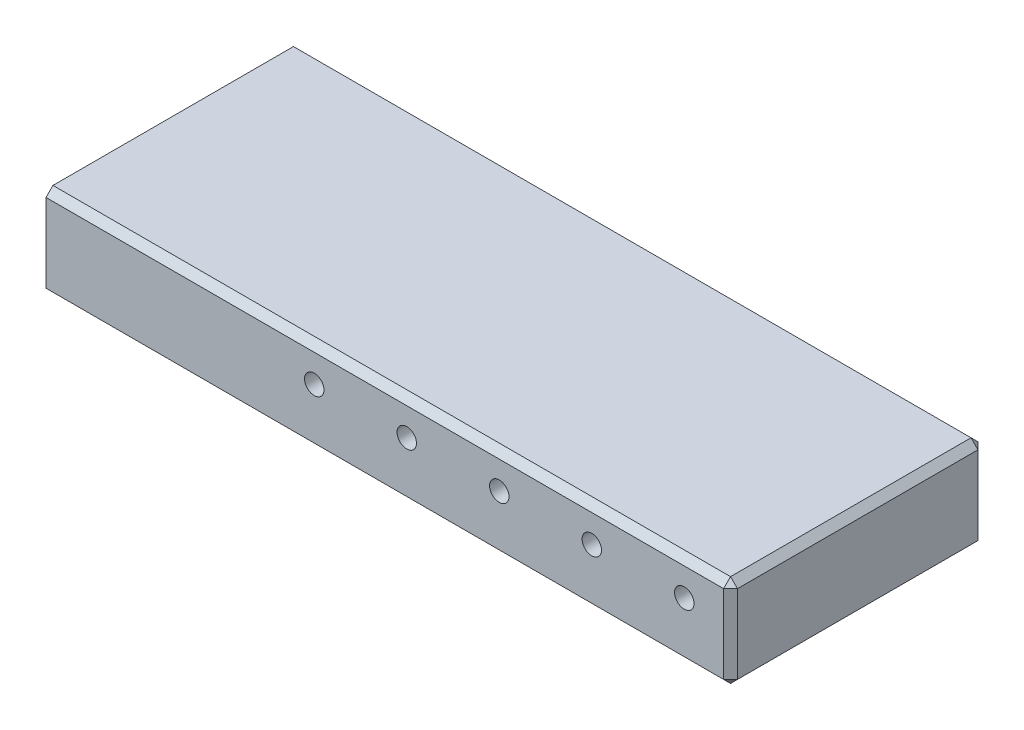
ISO-10303-21;
HEADER;
FILE_DESCRIPTION(('STEP AP214'),'2;1');
FILE_NAME('part.step','',(''),(''),'','','');
FILE_SCHEMA(('AUTOMOTIVE_DESIGN { 1 0 10303 214 1 1 1 1 }'));
ENDSEC;
DATA;
#1=APPLICATION_CONTEXT('core data for automotive mechanical design processes');
#2=APPLICATION_PROTOCOL_DEFINITION('international standard','automotive_design',2000,#1);
#3=PRODUCT_CONTEXT('',#1,'mechanical');
#4=PRODUCT('Part','Part','',(#3));
#5=PRODUCT_RELATED_PRODUCT_CATEGORY('part','',(#4));
#6=PRODUCT_DEFINITION_FORMATION('','',#4);
#7=PRODUCT_DEFINITION_CONTEXT('part definition',#1,'design');
#8=PRODUCT_DEFINITION('design','',#6,#7);
#9=PRODUCT_DEFINITION_SHAPE('','',#8);
#10=(LENGTH_UNIT() NAMED_UNIT(*) SI_UNIT(.MILLI.,.METRE.));
#11=(NAMED_UNIT(*) PLANE_ANGLE_UNIT() SI_UNIT($,.RADIAN.));
#12=(NAMED_UNIT(*) SI_UNIT($,.STERADIAN.) SOLID_ANGLE_UNIT());
#13=UNCERTAINTY_MEASURE_WITH_UNIT(LENGTH_MEASURE(1.E-05),#10,'distance_accuracy_value','');
#14=(GEOMETRIC_REPRESENTATION_CONTEXT(3) GLOBAL_UNCERTAINTY_ASSIGNED_CONTEXT((#13)) GLOBAL_UNIT_ASSIGNED_CONTEXT((#10,
#11,#12)) REPRESENTATION_CONTEXT('',''));
#15=CARTESIAN_POINT('',(0.,0.,0.));
#16=DIRECTION('',(0.,0.,1.));
#17=DIRECTION('',(1.,0.,0.));
#18=AXIS2_PLACEMENT_3D('',#15,#16,#17);
#19=CARTESIAN_POINT('',(0.,0.,55.));
#20=DIRECTION('',(0.,1.,0.));
#21=DIRECTION('',(0.,0.,1.));
#22=AXIS2_PLACEMENT_3D('',#19,#20,#21);
#23=PLANE('',#22);
#24=DIRECTION('',(-1.,0.,0.));
#25=VECTOR('',#24,1.);
#26=CARTESIAN_POINT('',(0.,0.,53.5));
#27=LINE('',#26,#25);
#28=CARTESIAN_POINT('',(108.5,0.,53.5));
#29=VERTEX_POINT('',#28);
#30=CARTESIAN_POINT('',(-38.,0.,53.5));
#31=VERTEX_POINT('',#30);
#32=EDGE_CURVE('E262',#29,#31,#27,.T.);
#33=ORIENTED_EDGE('',*,*,#32,.T.);
#34=DIRECTION('',(0.,0.,1.));
#35=VECTOR('',#34,1.);
#36=CARTESIAN_POINT('',(-38.,0.,53.5));
#37=LINE('',#36,#35);
#38=CARTESIAN_POINT('',(-38.,0.,1.50000000000002));
#39=VERTEX_POINT('',#38);
#40=EDGE_CURVE('E181',#39,#31,#37,.T.);
#41=ORIENTED_EDGE('',*,*,#40,.F.);
#42=DIRECTION('',(1.,0.,0.));
#43=VECTOR('',#42,1.);
#44=CARTESIAN_POINT('',(110.,0.,1.50000000000002));
#45=LINE('',#44,#43);
#46=CARTESIAN_POINT('',(108.5,0.,1.50000000000002));
#47=VERTEX_POINT('',#46);
#48=EDGE_CURVE('E264',#39,#47,#45,.T.);
#49=ORIENTED_EDGE('',*,*,#48,.T.);
#50=DIRECTION('',(0.,0.,1.));
#51=VECTOR('',#50,1.);
#52=CARTESIAN_POINT('',(108.5,0.,55.));
#53=LINE('',#52,#51);
#54=EDGE_CURVE('E260',#47,#29,#53,.T.);
#55=ORIENTED_EDGE('',*,*,#54,.T.);
#56=EDGE_LOOP('',(#33,#41,#49,#55));
#57=FACE_BOUND('',#56,.T.);
#58=ADVANCED_FACE('F39',(#57),#23,.F.);
#59=CARTESIAN_POINT('',(110.,0.,55.));
#60=DIRECTION('',(-1.,0.,0.));
#61=DIRECTION('',(0.,0.,1.));
#62=AXIS2_PLACEMENT_3D('',#59,#60,#61);
#63=PLANE('',#62);
#64=DIRECTION('',(0.,-1.,0.));
#65=VECTOR('',#64,1.);
#66=CARTESIAN_POINT('',(110.,0.,53.5));
#67=LINE('',#66,#65);
#68=CARTESIAN_POINT('',(110.,18.5,53.5));
#69=VERTEX_POINT('',#68);
#70=CARTESIAN_POINT('',(110.,1.50000000000002,53.5));
#71=VERTEX_POINT('',#70);
#72=EDGE_CURVE('E285',#69,#71,#67,.T.);
#73=ORIENTED_EDGE('',*,*,#72,.T.);
#74=DIRECTION('',(0.,0.,-1.));
#75=VECTOR('',#74,1.);
#76=CARTESIAN_POINT('',(110.,1.50000000000002,55.));
#77=LINE('',#76,#75);
#78=CARTESIAN_POINT('',(110.,1.50000000000002,1.50000000000002));
#79=VERTEX_POINT('',#78);
#80=EDGE_CURVE('E11',#71,#79,#77,.T.);
#81=ORIENTED_EDGE('',*,*,#80,.T.);
#82=DIRECTION('',(0.,1.,0.));
#83=VECTOR('',#82,1.);
#84=CARTESIAN_POINT('',(110.,20.,1.50000000000002));
#85=LINE('',#84,#83);
#86=CARTESIAN_POINT('',(110.,18.5,1.50000000000002));
#87=VERTEX_POINT('',#86);
#88=EDGE_CURVE('E49',#79,#87,#85,.T.);
#89=ORIENTED_EDGE('',*,*,#88,.T.);
#90=DIRECTION('',(0.,0.,1.));
#91=VECTOR('',#90,1.);
#92=CARTESIAN_POINT('',(110.,18.5,55.));
#93=LINE('',#92,#91);
#94=EDGE_CURVE('E287',#87,#69,#93,.T.);
#95=ORIENTED_EDGE('',*,*,#94,.T.);
#96=EDGE_LOOP('',(#73,#81,#89,#95));
#97=FACE_BOUND('',#96,.T.);
#98=ADVANCED_FACE('F350',(#97),#63,.F.);
#99=CARTESIAN_POINT('',(20.,20.,55.));
#100=DIRECTION('',(0.,-1.,0.));
#101=DIRECTION('',(0.,0.,-1.));
#102=AXIS2_PLACEMENT_3D('',#99,#100,#101);
#103=PLANE('',#102);
#104=DIRECTION('',(0.,0.,-1.));
#105=VECTOR('',#104,1.);
#106=CARTESIAN_POINT('',(108.5,20.,55.));
#107=LINE('',#106,#105);
#108=CARTESIAN_POINT('',(108.5,20.,53.5));
#109=VERTEX_POINT('',#108);
#110=CARTESIAN_POINT('',(108.5,20.,1.50000000000002));
#111=VERTEX_POINT('',#110);
#112=EDGE_CURVE('E281',#109,#111,#107,.T.);
#113=ORIENTED_EDGE('',*,*,#112,.T.);
#114=DIRECTION('',(-1.,0.,0.));
#115=VECTOR('',#114,1.);
#116=CARTESIAN_POINT('',(12.,20.,1.50000000000002));
#117=LINE('',#116,#115);
#118=CARTESIAN_POINT('',(-38.,20.,1.50000000000002));
#119=VERTEX_POINT('',#118);
#120=EDGE_CURVE('E283',#111,#119,#117,.T.);
#121=ORIENTED_EDGE('',*,*,#120,.T.);
#122=DIRECTION('',(0.,0.,-1.));
#123=VECTOR('',#122,1.);
#124=CARTESIAN_POINT('',(-38.,20.,1.50000000000002));
#125=LINE('',#124,#123);
#126=CARTESIAN_POINT('',(-38.,20.,53.5));
#127=VERTEX_POINT('',#126);
#128=EDGE_CURVE('E193',#127,#119,#125,.T.);
#129=ORIENTED_EDGE('',*,*,#128,.F.);
#130=DIRECTION('',(1.,0.,0.));
#131=VECTOR('',#130,1.);
#132=CARTESIAN_POINT('',(20.,20.,53.5));
#133=LINE('',#132,#131);
#134=EDGE_CURVE('E279',#127,#109,#133,.T.);
#135=ORIENTED_EDGE('',*,*,#134,.T.);
#136=EDGE_LOOP('',(#113,#121,#129,#135));
#137=FACE_BOUND('',#136,.T.);
#138=ADVANCED_FACE('F356',(#137),#103,.F.);
#139=CARTESIAN_POINT('',(0.,0.,55.));
#140=DIRECTION('',(0.,0.,-1.));
#141=DIRECTION('',(-1.,0.,0.));
#142=AXIS2_PLACEMENT_3D('',#139,#140,#141);
#143=PLANE('',#142);
#144=CARTESIAN_POINT('',(100.,12.5,55.));
#145=DIRECTION('',(0.,0.,1.));
#146=DIRECTION('',(1.,0.,0.));
#147=AXIS2_PLACEMENT_3D('',#144,#145,#146);
#148=CIRCLE('',#147,2.09999999999999);
#149=CARTESIAN_POINT('',(102.1,12.5,55.));
#150=VERTEX_POINT('',#149);
#151=EDGE_CURVE('E230',#150,#150,#148,.T.);
#152=ORIENTED_EDGE('',*,*,#151,.F.);
#153=EDGE_LOOP('',(#152));
#154=FACE_BOUND('',#153,.T.);
#155=CARTESIAN_POINT('',(80.,12.5,55.));
#156=DIRECTION('',(0.,0.,1.));
#157=DIRECTION('',(1.,0.,0.));
#158=AXIS2_PLACEMENT_3D('',#155,#156,#157);
#159=CIRCLE('',#158,2.09999999999999);
#160=CARTESIAN_POINT('',(82.1,12.5,55.));
#161=VERTEX_POINT('',#160);
#162=EDGE_CURVE('E236',#161,#161,#159,.T.);
#163=ORIENTED_EDGE('',*,*,#162,.F.);
#164=EDGE_LOOP('',(#163));
#165=FACE_BOUND('',#164,.T.);
#166=CARTESIAN_POINT('',(60.,12.5,55.));
#167=DIRECTION('',(0.,0.,1.));
#168=DIRECTION('',(1.,0.,0.));
#169=AXIS2_PLACEMENT_3D('',#166,#167,#168);
#170=CIRCLE('',#169,2.09999999999999);
#171=CARTESIAN_POINT('',(62.1,12.5,55.));
#172=VERTEX_POINT('',#171);
#173=EDGE_CURVE('E242',#172,#172,#170,.T.);
#174=ORIENTED_EDGE('',*,*,#173,.F.);
#175=EDGE_LOOP('',(#174));
#176=FACE_BOUND('',#175,.T.);
#177=CARTESIAN_POINT('',(40.,12.5,55.));
#178=DIRECTION('',(0.,0.,1.));
#179=DIRECTION('',(1.,0.,0.));
#180=AXIS2_PLACEMENT_3D('',#177,#178,#179);
#181=CIRCLE('',#180,2.09999999999999);
#182=CARTESIAN_POINT('',(42.1,12.5,55.));
#183=VERTEX_POINT('',#182);
#184=EDGE_CURVE('E248',#183,#183,#181,.T.);
#185=ORIENTED_EDGE('',*,*,#184,.F.);
#186=EDGE_LOOP('',(#185));
#187=FACE_BOUND('',#186,.T.);
#188=CARTESIAN_POINT('',(20.,12.5,55.));
#189=DIRECTION('',(0.,0.,1.));
#190=DIRECTION('',(1.,0.,0.));
#191=AXIS2_PLACEMENT_3D('',#188,#189,#190);
#192=CIRCLE('',#191,2.09999999999999);
#193=CARTESIAN_POINT('',(22.1,12.5,55.));
#194=VERTEX_POINT('',#193);
#195=EDGE_CURVE('E254',#194,#194,#192,.T.);
#196=ORIENTED_EDGE('',*,*,#195,.F.);
#197=EDGE_LOOP('',(#196));
#198=FACE_BOUND('',#197,.T.);
#199=DIRECTION('',(-1.,0.,0.));
#200=VECTOR('',#199,1.);
#201=CARTESIAN_POINT('',(0.,18.5,55.));
#202=LINE('',#201,#200);
#203=CARTESIAN_POINT('',(108.5,18.5,55.));
#204=VERTEX_POINT('',#203);
#205=CARTESIAN_POINT('',(-38.,18.5,55.));
#206=VERTEX_POINT('',#205);
#207=EDGE_CURVE('E273',#204,#206,#202,.T.);
#208=ORIENTED_EDGE('',*,*,#207,.T.);
#209=DIRECTION('',(0.,1.,0.));
#210=VECTOR('',#209,1.);
#211=CARTESIAN_POINT('',(-38.,18.5,55.));
#212=LINE('',#211,#210);
#213=CARTESIAN_POINT('',(-38.,1.50000000000002,55.));
#214=VERTEX_POINT('',#213);
#215=EDGE_CURVE('E187',#214,#206,#212,.T.);
#216=ORIENTED_EDGE('',*,*,#215,.F.);
#217=DIRECTION('',(1.,0.,0.));
#218=VECTOR('',#217,1.);
#219=CARTESIAN_POINT('',(0.,1.50000000000002,55.));
#220=LINE('',#219,#218);
#221=CARTESIAN_POINT('',(108.5,1.50000000000002,55.));
#222=VERTEX_POINT('',#221);
#223=EDGE_CURVE('E277',#214,#222,#220,.T.);
#224=ORIENTED_EDGE('',*,*,#223,.T.);
#225=DIRECTION('',(0.,1.,0.));
#226=VECTOR('',#225,1.);
#227=CARTESIAN_POINT('',(108.5,0.,55.));
#228=LINE('',#227,#226);
#229=EDGE_CURVE('E275',#222,#204,#228,.T.);
#230=ORIENTED_EDGE('',*,*,#229,.T.);
#231=EDGE_LOOP('',(#208,#216,#224,#230));
#232=FACE_BOUND('',#231,.T.);
#233=ADVANCED_FACE('F331',(#154,#165,#176,#187,#198,#232),#143,.F.);
#234=CARTESIAN_POINT('',(0.,0.,0.));
#235=DIRECTION('',(0.,0.,-1.));
#236=DIRECTION('',(-1.,0.,0.));
#237=AXIS2_PLACEMENT_3D('',#234,#235,#236);
#238=PLANE('',#237);
#239=DIRECTION('',(0.,-1.,0.));
#240=VECTOR('',#239,1.);
#241=CARTESIAN_POINT('',(108.5,0.,0.));
#242=LINE('',#241,#240);
#243=CARTESIAN_POINT('',(108.5,18.5,0.));
#244=VERTEX_POINT('',#243);
#245=CARTESIAN_POINT('',(108.5,1.50000000000002,0.));
#246=VERTEX_POINT('',#245);
#247=EDGE_CURVE('E267',#244,#246,#242,.T.);
#248=ORIENTED_EDGE('',*,*,#247,.T.);
#249=DIRECTION('',(-1.,0.,0.));
#250=VECTOR('',#249,1.);
#251=CARTESIAN_POINT('',(12.,1.50000000000002,0.));
#252=LINE('',#251,#250);
#253=CARTESIAN_POINT('',(-38.,1.50000000000002,0.));
#254=VERTEX_POINT('',#253);
#255=EDGE_CURVE('E271',#246,#254,#252,.T.);
#256=ORIENTED_EDGE('',*,*,#255,.T.);
#257=DIRECTION('',(0.,-1.,0.));
#258=VECTOR('',#257,1.);
#259=CARTESIAN_POINT('',(-38.,1.50000000000002,0.));
#260=LINE('',#259,#258);
#261=CARTESIAN_POINT('',(-38.,18.5,0.));
#262=VERTEX_POINT('',#261);
#263=EDGE_CURVE('E175',#262,#254,#260,.T.);
#264=ORIENTED_EDGE('',*,*,#263,.F.);
#265=DIRECTION('',(1.,0.,0.));
#266=VECTOR('',#265,1.);
#267=CARTESIAN_POINT('',(110.,18.5,0.));
#268=LINE('',#267,#266);
#269=EDGE_CURVE('E269',#262,#244,#268,.T.);
#270=ORIENTED_EDGE('',*,*,#269,.T.);
#271=EDGE_LOOP('',(#248,#256,#264,#270));
#272=FACE_BOUND('',#271,.T.);
#273=CARTESIAN_POINT('',(100.,12.5,0.));
#274=DIRECTION('',(0.,0.,-1.));
#275=DIRECTION('',(-1.,0.,0.));
#276=AXIS2_PLACEMENT_3D('',#273,#274,#275);
#277=CIRCLE('',#276,2.09999999999999);
#278=CARTESIAN_POINT('',(97.9,12.5,0.));
#279=VERTEX_POINT('',#278);
#280=EDGE_CURVE('E200',#279,#279,#277,.T.);
#281=ORIENTED_EDGE('',*,*,#280,.F.);
#282=EDGE_LOOP('',(#281));
#283=FACE_BOUND('',#282,.T.);
#284=CARTESIAN_POINT('',(80.,12.5,0.));
#285=DIRECTION('',(0.,0.,-1.));
#286=DIRECTION('',(-1.,0.,0.));
#287=AXIS2_PLACEMENT_3D('',#284,#285,#286);
#288=CIRCLE('',#287,2.09999999999999);
#289=CARTESIAN_POINT('',(77.9,12.5,0.));
#290=VERTEX_POINT('',#289);
#291=EDGE_CURVE('E206',#290,#290,#288,.T.);
#292=ORIENTED_EDGE('',*,*,#291,.F.);
#293=EDGE_LOOP('',(#292));
#294=FACE_BOUND('',#293,.T.);
#295=CARTESIAN_POINT('',(60.,12.5,0.));
#296=DIRECTION('',(0.,0.,-1.));
#297=DIRECTION('',(-1.,0.,0.));
#298=AXIS2_PLACEMENT_3D('',#295,#296,#297);
#299=CIRCLE('',#298,2.09999999999999);
#300=CARTESIAN_POINT('',(57.9,12.5,0.));
#301=VERTEX_POINT('',#300);
#302=EDGE_CURVE('E212',#301,#301,#299,.T.);
#303=ORIENTED_EDGE('',*,*,#302,.F.);
#304=EDGE_LOOP('',(#303));
#305=FACE_BOUND('',#304,.T.);
#306=CARTESIAN_POINT('',(40.,12.5,0.));
#307=DIRECTION('',(0.,0.,-1.));
#308=DIRECTION('',(-1.,0.,0.));
#309=AXIS2_PLACEMENT_3D('',#306,#307,#308);
#310=CIRCLE('',#309,2.09999999999999);
#311=CARTESIAN_POINT('',(37.9,12.5,0.));
#312=VERTEX_POINT('',#311);
#313=EDGE_CURVE('E218',#312,#312,#310,.T.);
#314=ORIENTED_EDGE('',*,*,#313,.F.);
#315=EDGE_LOOP('',(#314));
#316=FACE_BOUND('',#315,.T.);
#317=CARTESIAN_POINT('',(20.,12.5,0.));
#318=DIRECTION('',(0.,0.,-1.));
#319=DIRECTION('',(-1.,0.,0.));
#320=AXIS2_PLACEMENT_3D('',#317,#318,#319);
#321=CIRCLE('',#320,2.09999999999999);
#322=CARTESIAN_POINT('',(17.9,12.5,0.));
#323=VERTEX_POINT('',#322);
#324=EDGE_CURVE('E224',#323,#323,#321,.T.);
#325=ORIENTED_EDGE('',*,*,#324,.F.);
#326=EDGE_LOOP('',(#325));
#327=FACE_BOUND('',#326,.T.);
#328=ADVANCED_FACE('F364',(#272,#283,#294,#305,#316,#327),#238,.T.);
#329=CARTESIAN_POINT('',(20.,12.5,41.));
#330=DIRECTION('',(0.,0.,1.));
#331=DIRECTION('',(1.,0.,0.));
#332=AXIS2_PLACEMENT_3D('',#329,#330,#331);
#333=CONICAL_SURFACE('',#332,2.09999999999999,1.02974425867665);
#334=CARTESIAN_POINT('',(20.,12.5,39.7381927000421));
#335=VERTEX_POINT('',#334);
#336=VERTEX_LOOP('',#335);
#337=FACE_BOUND('',#336,.T.);
#338=CARTESIAN_POINT('',(20.,12.5,41.));
#339=DIRECTION('',(0.,0.,1.));
#340=DIRECTION('',(1.,0.,0.));
#341=AXIS2_PLACEMENT_3D('',#338,#339,#340);
#342=CIRCLE('',#341,2.09999999999999);
#343=CARTESIAN_POINT('',(22.1,12.5,41.));
#344=VERTEX_POINT('',#343);
#345=EDGE_CURVE('E257',#344,#344,#342,.T.);
#346=ORIENTED_EDGE('',*,*,#345,.T.);
#347=EDGE_LOOP('',(#346));
#348=FACE_BOUND('',#347,.T.);
#349=ADVANCED_FACE('F527',(#337,#348),#333,.F.);
#350=CARTESIAN_POINT('',(20.,12.5,55.));
#351=DIRECTION('',(0.,0.,1.));
#352=DIRECTION('',(1.,0.,0.));
#353=AXIS2_PLACEMENT_3D('',#350,#351,#352);
#354=CYLINDRICAL_SURFACE('',#353,2.09999999999999);
#355=ORIENTED_EDGE('',*,*,#345,.F.);
#356=EDGE_LOOP('',(#355));
#357=FACE_BOUND('',#356,.T.);
#358=ORIENTED_EDGE('',*,*,#195,.T.);
#359=EDGE_LOOP('',(#358));
#360=FACE_BOUND('',#359,.T.);
#361=ADVANCED_FACE('F523',(#357,#360),#354,.F.);
#362=CARTESIAN_POINT('',(40.,12.5,41.));
#363=DIRECTION('',(0.,0.,1.));
#364=DIRECTION('',(1.,0.,0.));
#365=AXIS2_PLACEMENT_3D('',#362,#363,#364);
#366=CONICAL_SURFACE('',#365,2.09999999999999,1.02974425867666);
#367=CARTESIAN_POINT('',(40.,12.5,39.7381927000421));
#368=VERTEX_POINT('',#367);
#369=VERTEX_LOOP('',#368);
#370=FACE_BOUND('',#369,.T.);
#371=CARTESIAN_POINT('',(40.,12.5,41.));
#372=DIRECTION('',(0.,0.,1.));
#373=DIRECTION('',(1.,0.,0.));
#374=AXIS2_PLACEMENT_3D('',#371,#372,#373);
#375=CIRCLE('',#374,2.09999999999999);
#376=CARTESIAN_POINT('',(42.1,12.5,41.));
#377=VERTEX_POINT('',#376);
#378=EDGE_CURVE('E251',#377,#377,#375,.T.);
#379=ORIENTED_EDGE('',*,*,#378,.T.);
#380=EDGE_LOOP('',(#379));
#381=FACE_BOUND('',#380,.T.);
#382=ADVANCED_FACE('F519',(#370,#381),#366,.F.);
#383=CARTESIAN_POINT('',(40.,12.5,55.));
#384=DIRECTION('',(0.,0.,1.));
#385=DIRECTION('',(1.,0.,0.));
#386=AXIS2_PLACEMENT_3D('',#383,#384,#385);
#387=CYLINDRICAL_SURFACE('',#386,2.09999999999999);
#388=ORIENTED_EDGE('',*,*,#378,.F.);
#389=EDGE_LOOP('',(#388));
#390=FACE_BOUND('',#389,.T.);
#391=ORIENTED_EDGE('',*,*,#184,.T.);
#392=EDGE_LOOP('',(#391));
#393=FACE_BOUND('',#392,.T.);
#394=ADVANCED_FACE('F515',(#390,#393),#387,.F.);
#395=CARTESIAN_POINT('',(60.,12.5,41.));
#396=DIRECTION('',(0.,0.,1.));
#397=DIRECTION('',(1.,0.,0.));
#398=AXIS2_PLACEMENT_3D('',#395,#396,#397);
#399=CONICAL_SURFACE('',#398,2.09999999999999,1.02974425867666);
#400=CARTESIAN_POINT('',(60.,12.5,39.7381927000421));
#401=VERTEX_POINT('',#400);
#402=VERTEX_LOOP('',#401);
#403=FACE_BOUND('',#402,.T.);
#404=CARTESIAN_POINT('',(60.,12.5,41.));
#405=DIRECTION('',(0.,0.,1.));
#406=DIRECTION('',(1.,0.,0.));
#407=AXIS2_PLACEMENT_3D('',#404,#405,#406);
#408=CIRCLE('',#407,2.09999999999999);
#409=CARTESIAN_POINT('',(62.1,12.5,41.));
#410=VERTEX_POINT('',#409);
#411=EDGE_CURVE('E245',#410,#410,#408,.T.);
#412=ORIENTED_EDGE('',*,*,#411,.T.);
#413=EDGE_LOOP('',(#412));
#414=FACE_BOUND('',#413,.T.);
#415=ADVANCED_FACE('F511',(#403,#414),#399,.F.);
#416=CARTESIAN_POINT('',(60.,12.5,55.));
#417=DIRECTION('',(0.,0.,1.));
#418=DIRECTION('',(1.,0.,0.));
#419=AXIS2_PLACEMENT_3D('',#416,#417,#418);
#420=CYLINDRICAL_SURFACE('',#419,2.09999999999999);
#421=ORIENTED_EDGE('',*,*,#411,.F.);
#422=EDGE_LOOP('',(#421));
#423=FACE_BOUND('',#422,.T.);
#424=ORIENTED_EDGE('',*,*,#173,.T.);
#425=EDGE_LOOP('',(#424));
#426=FACE_BOUND('',#425,.T.);
#427=ADVANCED_FACE('F507',(#423,#426),#420,.F.);
#428=CARTESIAN_POINT('',(80.,12.5,41.));
#429=DIRECTION('',(0.,0.,1.));
#430=DIRECTION('',(1.,0.,0.));
#431=AXIS2_PLACEMENT_3D('',#428,#429,#430);
#432=CONICAL_SURFACE('',#431,2.09999999999999,1.02974425867666);
#433=CARTESIAN_POINT('',(80.,12.5,39.7381927000421));
#434=VERTEX_POINT('',#433);
#435=VERTEX_LOOP('',#434);
#436=FACE_BOUND('',#435,.T.);
#437=CARTESIAN_POINT('',(80.,12.5,41.));
#438=DIRECTION('',(0.,0.,1.));
#439=DIRECTION('',(1.,0.,0.));
#440=AXIS2_PLACEMENT_3D('',#437,#438,#439);
#441=CIRCLE('',#440,2.09999999999999);
#442=CARTESIAN_POINT('',(82.1,12.5,41.));
#443=VERTEX_POINT('',#442);
#444=EDGE_CURVE('E239',#443,#443,#441,.T.);
#445=ORIENTED_EDGE('',*,*,#444,.T.);
#446=EDGE_LOOP('',(#445));
#447=FACE_BOUND('',#446,.T.);
#448=ADVANCED_FACE('F503',(#436,#447),#432,.F.);
#449=CARTESIAN_POINT('',(80.,12.5,55.));
#450=DIRECTION('',(0.,0.,1.));
#451=DIRECTION('',(1.,0.,0.));
#452=AXIS2_PLACEMENT_3D('',#449,#450,#451);
#453=CYLINDRICAL_SURFACE('',#452,2.09999999999999);
#454=ORIENTED_EDGE('',*,*,#444,.F.);
#455=EDGE_LOOP('',(#454));
#456=FACE_BOUND('',#455,.T.);
#457=ORIENTED_EDGE('',*,*,#162,.T.);
#458=EDGE_LOOP('',(#457));
#459=FACE_BOUND('',#458,.T.);
#460=ADVANCED_FACE('F499',(#456,#459),#453,.F.);
#461=CARTESIAN_POINT('',(100.,12.5,41.));
#462=DIRECTION('',(0.,0.,1.));
#463=DIRECTION('',(1.,0.,0.));
#464=AXIS2_PLACEMENT_3D('',#461,#462,#463);
#465=CONICAL_SURFACE('',#464,2.09999999999999,1.02974425867666);
#466=CARTESIAN_POINT('',(100.,12.5,39.7381927000421));
#467=VERTEX_POINT('',#466);
#468=VERTEX_LOOP('',#467);
#469=FACE_BOUND('',#468,.T.);
#470=CARTESIAN_POINT('',(100.,12.5,41.));
#471=DIRECTION('',(0.,0.,1.));
#472=DIRECTION('',(1.,0.,0.));
#473=AXIS2_PLACEMENT_3D('',#470,#471,#472);
#474=CIRCLE('',#473,2.09999999999999);
#475=CARTESIAN_POINT('',(102.1,12.5,41.));
#476=VERTEX_POINT('',#475);
#477=EDGE_CURVE('E233',#476,#476,#474,.T.);
#478=ORIENTED_EDGE('',*,*,#477,.T.);
#479=EDGE_LOOP('',(#478));
#480=FACE_BOUND('',#479,.T.);
#481=ADVANCED_FACE('F495',(#469,#480),#465,.F.);
#482=CARTESIAN_POINT('',(100.,12.5,55.));
#483=DIRECTION('',(0.,0.,1.));
#484=DIRECTION('',(1.,0.,0.));
#485=AXIS2_PLACEMENT_3D('',#482,#483,#484);
#486=CYLINDRICAL_SURFACE('',#485,2.09999999999999);
#487=ORIENTED_EDGE('',*,*,#477,.F.);
#488=EDGE_LOOP('',(#487));
#489=FACE_BOUND('',#488,.T.);
#490=ORIENTED_EDGE('',*,*,#151,.T.);
#491=EDGE_LOOP('',(#490));
#492=FACE_BOUND('',#491,.T.);
#493=ADVANCED_FACE('F491',(#489,#492),#486,.F.);
#494=CARTESIAN_POINT('',(20.,12.5,14.));
#495=DIRECTION('',(0.,0.,-1.));
#496=DIRECTION('',(-1.,0.,0.));
#497=AXIS2_PLACEMENT_3D('',#494,#495,#496);
#498=CONICAL_SURFACE('',#497,2.09999999999999,1.02974425867665);
#499=CARTESIAN_POINT('',(20.,12.5,15.2618072999579));
#500=VERTEX_POINT('',#499);
#501=VERTEX_LOOP('',#500);
#502=FACE_BOUND('',#501,.T.);
#503=CARTESIAN_POINT('',(20.,12.5,14.));
#504=DIRECTION('',(0.,0.,-1.));
#505=DIRECTION('',(-1.,0.,0.));
#506=AXIS2_PLACEMENT_3D('',#503,#504,#505);
#507=CIRCLE('',#506,2.09999999999999);
#508=CARTESIAN_POINT('',(17.9,12.5,14.));
#509=VERTEX_POINT('',#508);
#510=EDGE_CURVE('E227',#509,#509,#507,.T.);
#511=ORIENTED_EDGE('',*,*,#510,.T.);
#512=EDGE_LOOP('',(#511));
#513=FACE_BOUND('',#512,.T.);
#514=ADVANCED_FACE('F487',(#502,#513),#498,.F.);
#515=CARTESIAN_POINT('',(20.,12.5,0.));
#516=DIRECTION('',(0.,0.,-1.));
#517=DIRECTION('',(-1.,0.,0.));
#518=AXIS2_PLACEMENT_3D('',#515,#516,#517);
#519=CYLINDRICAL_SURFACE('',#518,2.09999999999999);
#520=ORIENTED_EDGE('',*,*,#510,.F.);
#521=EDGE_LOOP('',(#520));
#522=FACE_BOUND('',#521,.T.);
#523=ORIENTED_EDGE('',*,*,#324,.T.);
#524=EDGE_LOOP('',(#523));
#525=FACE_BOUND('',#524,.T.);
#526=ADVANCED_FACE('F483',(#522,#525),#519,.F.);
#527=CARTESIAN_POINT('',(40.,12.5,14.));
#528=DIRECTION('',(0.,0.,-1.));
#529=DIRECTION('',(-1.,0.,0.));
#530=AXIS2_PLACEMENT_3D('',#527,#528,#529);
#531=CONICAL_SURFACE('',#530,2.09999999999999,1.02974425867666);
#532=CARTESIAN_POINT('',(40.,12.5,15.2618072999579));
#533=VERTEX_POINT('',#532);
#534=VERTEX_LOOP('',#533);
#535=FACE_BOUND('',#534,.T.);
#536=CARTESIAN_POINT('',(40.,12.5,14.));
#537=DIRECTION('',(0.,0.,-1.));
#538=DIRECTION('',(-1.,0.,0.));
#539=AXIS2_PLACEMENT_3D('',#536,#537,#538);
#540=CIRCLE('',#539,2.09999999999999);
#541=CARTESIAN_POINT('',(37.9,12.5,14.));
#542=VERTEX_POINT('',#541);
#543=EDGE_CURVE('E221',#542,#542,#540,.T.);
#544=ORIENTED_EDGE('',*,*,#543,.T.);
#545=EDGE_LOOP('',(#544));
#546=FACE_BOUND('',#545,.T.);
#547=ADVANCED_FACE('F479',(#535,#546),#531,.F.);
#548=CARTESIAN_POINT('',(40.,12.5,0.));
#549=DIRECTION('',(0.,0.,-1.));
#550=DIRECTION('',(-1.,0.,0.));
#551=AXIS2_PLACEMENT_3D('',#548,#549,#550);
#552=CYLINDRICAL_SURFACE('',#551,2.09999999999999);
#553=ORIENTED_EDGE('',*,*,#543,.F.);
#554=EDGE_LOOP('',(#553));
#555=FACE_BOUND('',#554,.T.);
#556=ORIENTED_EDGE('',*,*,#313,.T.);
#557=EDGE_LOOP('',(#556));
#558=FACE_BOUND('',#557,.T.);
#559=ADVANCED_FACE('F475',(#555,#558),#552,.F.);
#560=CARTESIAN_POINT('',(60.,12.5,14.));
#561=DIRECTION('',(0.,0.,-1.));
#562=DIRECTION('',(-1.,0.,0.));
#563=AXIS2_PLACEMENT_3D('',#560,#561,#562);
#564=CONICAL_SURFACE('',#563,2.09999999999999,1.02974425867666);
#565=CARTESIAN_POINT('',(60.,12.5,15.2618072999579));
#566=VERTEX_POINT('',#565);
#567=VERTEX_LOOP('',#566);
#568=FACE_BOUND('',#567,.T.);
#569=CARTESIAN_POINT('',(60.,12.5,14.));
#570=DIRECTION('',(0.,0.,-1.));
#571=DIRECTION('',(-1.,0.,0.));
#572=AXIS2_PLACEMENT_3D('',#569,#570,#571);
#573=CIRCLE('',#572,2.09999999999999);
#574=CARTESIAN_POINT('',(57.9,12.5,14.));
#575=VERTEX_POINT('',#574);
#576=EDGE_CURVE('E215',#575,#575,#573,.T.);
#577=ORIENTED_EDGE('',*,*,#576,.T.);
#578=EDGE_LOOP('',(#577));
#579=FACE_BOUND('',#578,.T.);
#580=ADVANCED_FACE('F471',(#568,#579),#564,.F.);
#581=CARTESIAN_POINT('',(60.,12.5,0.));
#582=DIRECTION('',(0.,0.,-1.));
#583=DIRECTION('',(-1.,0.,0.));
#584=AXIS2_PLACEMENT_3D('',#581,#582,#583);
#585=CYLINDRICAL_SURFACE('',#584,2.09999999999999);
#586=ORIENTED_EDGE('',*,*,#576,.F.);
#587=EDGE_LOOP('',(#586));
#588=FACE_BOUND('',#587,.T.);
#589=ORIENTED_EDGE('',*,*,#302,.T.);
#590=EDGE_LOOP('',(#589));
#591=FACE_BOUND('',#590,.T.);
#592=ADVANCED_FACE('F467',(#588,#591),#585,.F.);
#593=CARTESIAN_POINT('',(80.,12.5,14.));
#594=DIRECTION('',(0.,0.,-1.));
#595=DIRECTION('',(-1.,0.,0.));
#596=AXIS2_PLACEMENT_3D('',#593,#594,#595);
#597=CONICAL_SURFACE('',#596,2.09999999999999,1.02974425867666);
#598=CARTESIAN_POINT('',(80.,12.5,15.2618072999579));
#599=VERTEX_POINT('',#598);
#600=VERTEX_LOOP('',#599);
#601=FACE_BOUND('',#600,.T.);
#602=CARTESIAN_POINT('',(80.,12.5,14.));
#603=DIRECTION('',(0.,0.,-1.));
#604=DIRECTION('',(-1.,0.,0.));
#605=AXIS2_PLACEMENT_3D('',#602,#603,#604);
#606=CIRCLE('',#605,2.09999999999999);
#607=CARTESIAN_POINT('',(77.9,12.5,14.));
#608=VERTEX_POINT('',#607);
#609=EDGE_CURVE('E209',#608,#608,#606,.T.);
#610=ORIENTED_EDGE('',*,*,#609,.T.);
#611=EDGE_LOOP('',(#610));
#612=FACE_BOUND('',#611,.T.);
#613=ADVANCED_FACE('F463',(#601,#612),#597,.F.);
#614=CARTESIAN_POINT('',(80.,12.5,0.));
#615=DIRECTION('',(0.,0.,-1.));
#616=DIRECTION('',(-1.,0.,0.));
#617=AXIS2_PLACEMENT_3D('',#614,#615,#616);
#618=CYLINDRICAL_SURFACE('',#617,2.09999999999999);
#619=ORIENTED_EDGE('',*,*,#609,.F.);
#620=EDGE_LOOP('',(#619));
#621=FACE_BOUND('',#620,.T.);
#622=ORIENTED_EDGE('',*,*,#291,.T.);
#623=EDGE_LOOP('',(#622));
#624=FACE_BOUND('',#623,.T.);
#625=ADVANCED_FACE('F453',(#621,#624),#618,.F.);
#626=CARTESIAN_POINT('',(100.,12.5,14.));
#627=DIRECTION('',(0.,0.,-1.));
#628=DIRECTION('',(-1.,0.,0.));
#629=AXIS2_PLACEMENT_3D('',#626,#627,#628);
#630=CONICAL_SURFACE('',#629,2.09999999999999,1.02974425867666);
#631=CARTESIAN_POINT('',(100.,12.5,15.2618072999579));
#632=VERTEX_POINT('',#631);
#633=VERTEX_LOOP('',#632);
#634=FACE_BOUND('',#633,.T.);
#635=CARTESIAN_POINT('',(100.,12.5,14.));
#636=DIRECTION('',(0.,0.,-1.));
#637=DIRECTION('',(-1.,0.,0.));
#638=AXIS2_PLACEMENT_3D('',#635,#636,#637);
#639=CIRCLE('',#638,2.09999999999999);
#640=CARTESIAN_POINT('',(97.9,12.5,14.));
#641=VERTEX_POINT('',#640);
#642=EDGE_CURVE('E203',#641,#641,#639,.T.);
#643=ORIENTED_EDGE('',*,*,#642,.T.);
#644=EDGE_LOOP('',(#643));
#645=FACE_BOUND('',#644,.T.);
#646=ADVANCED_FACE('F447',(#634,#645),#630,.F.);
#647=CARTESIAN_POINT('',(100.,12.5,0.));
#648=DIRECTION('',(0.,0.,-1.));
#649=DIRECTION('',(-1.,0.,0.));
#650=AXIS2_PLACEMENT_3D('',#647,#648,#649);
#651=CYLINDRICAL_SURFACE('',#650,2.09999999999999);
#652=ORIENTED_EDGE('',*,*,#642,.F.);
#653=EDGE_LOOP('',(#652));
#654=FACE_BOUND('',#653,.T.);
#655=ORIENTED_EDGE('',*,*,#280,.T.);
#656=EDGE_LOOP('',(#655));
#657=FACE_BOUND('',#656,.T.);
#658=ADVANCED_FACE('F443',(#654,#657),#651,.F.);
#659=CARTESIAN_POINT('',(0.,18.5,55.));
#660=DIRECTION('',(0.,-0.707106781186547,-0.707106781186547));
#661=DIRECTION('',(-1.,0.,0.));
#662=AXIS2_PLACEMENT_3D('',#659,#660,#661);
#663=PLANE('',#662);
#664=DIRECTION('',(0.,0.707106781186547,-0.707106781186547));
#665=VECTOR('',#664,1.);
#666=CARTESIAN_POINT('',(108.5,19.25,54.25));
#667=LINE('',#666,#665);
#668=EDGE_CURVE('E44',#109,#204,#667,.F.);
#669=ORIENTED_EDGE('',*,*,#668,.F.);
#670=ORIENTED_EDGE('',*,*,#134,.F.);
#671=DIRECTION('',(0.,0.707106781186545,-0.70710678118655));
#672=VECTOR('',#671,1.);
#673=CARTESIAN_POINT('',(-38.,20.,53.5));
#674=LINE('',#673,#672);
#675=EDGE_CURVE('E190',#206,#127,#674,.T.);
#676=ORIENTED_EDGE('',*,*,#675,.F.);
#677=ORIENTED_EDGE('',*,*,#207,.F.);
#678=EDGE_LOOP('',(#669,#670,#676,#677));
#679=FACE_BOUND('',#678,.T.);
#680=ADVANCED_FACE('F42',(#679),#663,.F.);
#681=CARTESIAN_POINT('',(110.,18.5,53.5));
#682=DIRECTION('',(0.577350269189626,0.577350269189626,0.577350269189626));
#683=DIRECTION('',(0.707106781186547,0.,-0.707106781186547));
#684=AXIS2_PLACEMENT_3D('',#681,#682,#683);
#685=PLANE('',#684);
#686=DIRECTION('',(0.707106781186547,-0.707106781186547,0.));
#687=VECTOR('',#686,1.);
#688=CARTESIAN_POINT('',(110.,18.5,53.5));
#689=LINE('',#688,#687);
#690=EDGE_CURVE('E312',#109,#69,#689,.T.);
#691=ORIENTED_EDGE('',*,*,#690,.F.);
#692=ORIENTED_EDGE('',*,*,#668,.T.);
#693=DIRECTION('',(-0.707106781186547,0.,0.707106781186547));
#694=VECTOR('',#693,1.);
#695=CARTESIAN_POINT('',(110.,18.5,53.5));
#696=LINE('',#695,#694);
#697=EDGE_CURVE('E314',#69,#204,#696,.T.);
#698=ORIENTED_EDGE('',*,*,#697,.F.);
#699=EDGE_LOOP('',(#691,#692,#698));
#700=FACE_BOUND('',#699,.T.);
#701=ADVANCED_FACE('F324',(#700),#685,.T.);
#702=CARTESIAN_POINT('',(0.,1.50000000000002,55.));
#703=DIRECTION('',(0.,0.707106781186547,-0.707106781186547));
#704=DIRECTION('',(1.,0.,0.));
#705=AXIS2_PLACEMENT_3D('',#702,#703,#704);
#706=PLANE('',#705);
#707=ORIENTED_EDGE('',*,*,#223,.F.);
#708=DIRECTION('',(0.,0.707106781186547,0.707106781186547));
#709=VECTOR('',#708,1.);
#710=CARTESIAN_POINT('',(-38.,1.50000000000002,55.));
#711=LINE('',#710,#709);
#712=EDGE_CURVE('E184',#31,#214,#711,.T.);
#713=ORIENTED_EDGE('',*,*,#712,.F.);
#714=ORIENTED_EDGE('',*,*,#32,.F.);
#715=DIRECTION('',(0.,0.707106781186547,0.707106781186547));
#716=VECTOR('',#715,1.);
#717=CARTESIAN_POINT('',(108.5,1.50000000000002,55.));
#718=LINE('',#717,#716);
#719=EDGE_CURVE('E309',#222,#29,#718,.F.);
#720=ORIENTED_EDGE('',*,*,#719,.F.);
#721=EDGE_LOOP('',(#707,#713,#714,#720));
#722=FACE_BOUND('',#721,.T.);
#723=ADVANCED_FACE('F339',(#722),#706,.F.);
#724=CARTESIAN_POINT('',(108.5,0.,55.));
#725=DIRECTION('',(-0.707106781186547,0.,-0.707106781186547));
#726=DIRECTION('',(0.,1.,0.));
#727=AXIS2_PLACEMENT_3D('',#724,#725,#726);
#728=PLANE('',#727);
#729=ORIENTED_EDGE('',*,*,#697,.T.);
#730=ORIENTED_EDGE('',*,*,#229,.F.);
#731=DIRECTION('',(0.707106781186547,0.,-0.707106781186547));
#732=VECTOR('',#731,1.);
#733=CARTESIAN_POINT('',(108.5,1.50000000000002,55.));
#734=LINE('',#733,#732);
#735=EDGE_CURVE('E306',#71,#222,#734,.F.);
#736=ORIENTED_EDGE('',*,*,#735,.F.);
#737=ORIENTED_EDGE('',*,*,#72,.F.);
#738=EDGE_LOOP('',(#729,#730,#736,#737));
#739=FACE_BOUND('',#738,.T.);
#740=ADVANCED_FACE('F342',(#739),#728,.F.);
#741=CARTESIAN_POINT('',(108.5,20.,55.));
#742=DIRECTION('',(-0.707106781186547,-0.707106781186547,0.));
#743=DIRECTION('',(0.,0.,-1.));
#744=AXIS2_PLACEMENT_3D('',#741,#742,#743);
#745=PLANE('',#744);
#746=ORIENTED_EDGE('',*,*,#690,.T.);
#747=ORIENTED_EDGE('',*,*,#94,.F.);
#748=DIRECTION('',(-0.707106781186547,0.707106781186547,0.));
#749=VECTOR('',#748,1.);
#750=CARTESIAN_POINT('',(109.25,19.25,1.50000000000002));
#751=LINE('',#750,#749);
#752=EDGE_CURVE('E303',#111,#87,#751,.F.);
#753=ORIENTED_EDGE('',*,*,#752,.F.);
#754=ORIENTED_EDGE('',*,*,#112,.F.);
#755=EDGE_LOOP('',(#746,#747,#753,#754));
#756=FACE_BOUND('',#755,.T.);
#757=ADVANCED_FACE('F353',(#756),#745,.F.);
#758=CARTESIAN_POINT('',(20.,20.,1.50000000000002));
#759=DIRECTION('',(0.,0.707106781186547,-0.707106781186547));
#760=DIRECTION('',(1.,0.,0.));
#761=AXIS2_PLACEMENT_3D('',#758,#759,#760);
#762=PLANE('',#761);
#763=ORIENTED_EDGE('',*,*,#269,.F.);
#764=DIRECTION('',(0.,-0.707106781186545,-0.70710678118655));
#765=VECTOR('',#764,1.);
#766=CARTESIAN_POINT('',(-38.,18.5,0.));
#767=LINE('',#766,#765);
#768=EDGE_CURVE('E196',#119,#262,#767,.T.);
#769=ORIENTED_EDGE('',*,*,#768,.F.);
#770=ORIENTED_EDGE('',*,*,#120,.F.);
#771=DIRECTION('',(0.,0.707106781186547,0.707106781186547));
#772=VECTOR('',#771,1.);
#773=CARTESIAN_POINT('',(108.5,18.5,0.));
#774=LINE('',#773,#772);
#775=EDGE_CURVE('E300',#244,#111,#774,.T.);
#776=ORIENTED_EDGE('',*,*,#775,.F.);
#777=EDGE_LOOP('',(#763,#769,#770,#776));
#778=FACE_BOUND('',#777,.T.);
#779=ADVANCED_FACE('F360',(#778),#762,.T.);
#780=CARTESIAN_POINT('',(108.5,1.50000000000002,55.));
#781=DIRECTION('',(0.577350269189626,-0.577350269189626,0.577350269189626));
#782=DIRECTION('',(0.707106781186547,0.,-0.707106781186547));
#783=AXIS2_PLACEMENT_3D('',#780,#781,#782);
#784=PLANE('',#783);
#785=ORIENTED_EDGE('',*,*,#735,.T.);
#786=ORIENTED_EDGE('',*,*,#719,.T.);
#787=DIRECTION('',(-0.707106781186547,-0.707106781186547,0.));
#788=VECTOR('',#787,1.);
#789=CARTESIAN_POINT('',(109.25,0.750000000000008,53.5));
#790=LINE('',#789,#788);
#791=EDGE_CURVE('E297',#71,#29,#790,.T.);
#792=ORIENTED_EDGE('',*,*,#791,.F.);
#793=EDGE_LOOP('',(#785,#786,#792));
#794=FACE_BOUND('',#793,.T.);
#795=ADVANCED_FACE('F346',(#794),#784,.T.);
#796=CARTESIAN_POINT('',(108.5,18.5,0.));
#797=DIRECTION('',(0.577350269189626,0.577350269189626,-0.577350269189626));
#798=DIRECTION('',(-0.707106781186547,0.,-0.707106781186547));
#799=AXIS2_PLACEMENT_3D('',#796,#797,#798);
#800=PLANE('',#799);
#801=ORIENTED_EDGE('',*,*,#775,.T.);
#802=ORIENTED_EDGE('',*,*,#752,.T.);
#803=DIRECTION('',(-0.707106781186547,0.,-0.707106781186547));
#804=VECTOR('',#803,1.);
#805=CARTESIAN_POINT('',(108.5,18.5,0.));
#806=LINE('',#805,#804);
#807=EDGE_CURVE('E294',#244,#87,#806,.F.);
#808=ORIENTED_EDGE('',*,*,#807,.F.);
#809=EDGE_LOOP('',(#801,#802,#808));
#810=FACE_BOUND('',#809,.T.);
#811=ADVANCED_FACE('F406',(#810),#800,.T.);
#812=CARTESIAN_POINT('',(110.,1.50000000000002,55.));
#813=DIRECTION('',(-0.707106781186547,0.707106781186547,0.));
#814=DIRECTION('',(0.,0.,-1.));
#815=AXIS2_PLACEMENT_3D('',#812,#813,#814);
#816=PLANE('',#815);
#817=ORIENTED_EDGE('',*,*,#791,.T.);
#818=ORIENTED_EDGE('',*,*,#54,.F.);
#819=DIRECTION('',(0.707106781186547,0.707106781186547,0.));
#820=VECTOR('',#819,1.);
#821=CARTESIAN_POINT('',(108.5,0.,1.50000000000002));
#822=LINE('',#821,#820);
#823=EDGE_CURVE('E292',#79,#47,#822,.F.);
#824=ORIENTED_EDGE('',*,*,#823,.F.);
#825=ORIENTED_EDGE('',*,*,#80,.F.);
#826=EDGE_LOOP('',(#817,#818,#824,#825));
#827=FACE_BOUND('',#826,.T.);
#828=ADVANCED_FACE('F349',(#827),#816,.F.);
#829=CARTESIAN_POINT('',(110.,0.,1.50000000000002));
#830=DIRECTION('',(0.707106781186547,0.,-0.707106781186547));
#831=DIRECTION('',(0.,-1.,0.));
#832=AXIS2_PLACEMENT_3D('',#829,#830,#831);
#833=PLANE('',#832);
#834=ORIENTED_EDGE('',*,*,#807,.T.);
#835=ORIENTED_EDGE('',*,*,#88,.F.);
#836=DIRECTION('',(0.707106781186547,0.,0.707106781186547));
#837=VECTOR('',#836,1.);
#838=CARTESIAN_POINT('',(109.25,1.50000000000002,0.750000000000008));
#839=LINE('',#838,#837);
#840=EDGE_CURVE('E57',#246,#79,#839,.T.);
#841=ORIENTED_EDGE('',*,*,#840,.F.);
#842=ORIENTED_EDGE('',*,*,#247,.F.);
#843=EDGE_LOOP('',(#834,#835,#841,#842));
#844=FACE_BOUND('',#843,.T.);
#845=ADVANCED_FACE('F394',(#844),#833,.T.);
#846=CARTESIAN_POINT('',(108.5,0.,1.50000000000002));
#847=DIRECTION('',(0.577350269189626,-0.577350269189626,-0.577350269189626));
#848=DIRECTION('',(-0.707106781186547,0.,-0.707106781186547));
#849=AXIS2_PLACEMENT_3D('',#846,#847,#848);
#850=PLANE('',#849);
#851=ORIENTED_EDGE('',*,*,#840,.T.);
#852=ORIENTED_EDGE('',*,*,#823,.T.);
#853=DIRECTION('',(0.,0.707106781186547,-0.707106781186547));
#854=VECTOR('',#853,1.);
#855=CARTESIAN_POINT('',(108.5,0.,1.50000000000002));
#856=LINE('',#855,#854);
#857=EDGE_CURVE('E199',#246,#47,#856,.F.);
#858=ORIENTED_EDGE('',*,*,#857,.F.);
#859=EDGE_LOOP('',(#851,#852,#858));
#860=FACE_BOUND('',#859,.T.);
#861=ADVANCED_FACE('F388',(#860),#850,.T.);
#862=CARTESIAN_POINT('',(0.,0.,1.50000000000002));
#863=DIRECTION('',(0.,-0.707106781186547,-0.707106781186547));
#864=DIRECTION('',(-1.,0.,0.));
#865=AXIS2_PLACEMENT_3D('',#862,#863,#864);
#866=PLANE('',#865);
#867=ORIENTED_EDGE('',*,*,#48,.F.);
#868=DIRECTION('',(0.,-0.707106781186547,0.707106781186547));
#869=VECTOR('',#868,1.);
#870=CARTESIAN_POINT('',(-38.,0.,1.50000000000002));
#871=LINE('',#870,#869);
#872=EDGE_CURVE('E178',#254,#39,#871,.T.);
#873=ORIENTED_EDGE('',*,*,#872,.F.);
#874=ORIENTED_EDGE('',*,*,#255,.F.);
#875=ORIENTED_EDGE('',*,*,#857,.T.);
#876=EDGE_LOOP('',(#867,#873,#874,#875));
#877=FACE_BOUND('',#876,.T.);
#878=ADVANCED_FACE('F370',(#877),#866,.T.);
#879=CARTESIAN_POINT('',(-38.,0.,0.));
#880=DIRECTION('',(1.,0.,0.));
#881=DIRECTION('',(0.,0.,-1.));
#882=AXIS2_PLACEMENT_3D('',#879,#880,#881);
#883=PLANE('',#882);
#884=CARTESIAN_POINT('',(-38.,10.,15.));
#885=DIRECTION('',(-1.,0.,0.));
#886=DIRECTION('',(0.,0.,1.));
#887=AXIS2_PLACEMENT_3D('',#884,#885,#886);
#888=CIRCLE('',#887,2.5);
#889=CARTESIAN_POINT('',(-38.,10.,17.5));
#890=VERTEX_POINT('',#889);
#891=EDGE_CURVE('E165',#890,#890,#888,.T.);
#892=ORIENTED_EDGE('',*,*,#891,.F.);
#893=EDGE_LOOP('',(#892));
#894=FACE_BOUND('',#893,.T.);
#895=CARTESIAN_POINT('',(-38.,10.,40.));
#896=DIRECTION('',(-1.,0.,0.));
#897=DIRECTION('',(0.,0.,1.));
#898=AXIS2_PLACEMENT_3D('',#895,#896,#897);
#899=CIRCLE('',#898,2.5);
#900=CARTESIAN_POINT('',(-38.,10.,42.5));
#901=VERTEX_POINT('',#900);
#902=EDGE_CURVE('E164',#901,#901,#899,.T.);
#903=ORIENTED_EDGE('',*,*,#902,.F.);
#904=EDGE_LOOP('',(#903));
#905=FACE_BOUND('',#904,.T.);
#906=ORIENTED_EDGE('',*,*,#263,.T.);
#907=ORIENTED_EDGE('',*,*,#872,.T.);
#908=ORIENTED_EDGE('',*,*,#40,.T.);
#909=ORIENTED_EDGE('',*,*,#712,.T.);
#910=ORIENTED_EDGE('',*,*,#215,.T.);
#911=ORIENTED_EDGE('',*,*,#675,.T.);
#912=ORIENTED_EDGE('',*,*,#128,.T.);
#913=ORIENTED_EDGE('',*,*,#768,.T.);
#914=EDGE_LOOP('',(#906,#907,#908,#909,#910,#911,#912,#913));
#915=FACE_BOUND('',#914,.T.);
#916=ADVANCED_FACE('F333',(#894,#905,#915),#883,.F.);
#917=CARTESIAN_POINT('',(-14.5021515475689,10.,40.));
#918=DIRECTION('',(-1.,0.,0.));
#919=DIRECTION('',(0.,0.,1.));
#920=AXIS2_PLACEMENT_3D('',#917,#918,#919);
#921=CONICAL_SURFACE('',#920,2.5,1.02974425867665);
#922=CARTESIAN_POINT('',(-13.,9.99999999999999,40.));
#923=VERTEX_POINT('',#922);
#924=VERTEX_LOOP('',#923);
#925=FACE_BOUND('',#924,.T.);
#926=CARTESIAN_POINT('',(-14.5021515475689,10.,40.));
#927=DIRECTION('',(-1.,0.,0.));
#928=DIRECTION('',(0.,0.,1.));
#929=AXIS2_PLACEMENT_3D('',#926,#927,#928);
#930=CIRCLE('',#929,2.5);
#931=CARTESIAN_POINT('',(-14.5021515475689,10.,42.5));
#932=VERTEX_POINT('',#931);
#933=EDGE_CURVE('E168',#932,#932,#930,.T.);
#934=ORIENTED_EDGE('',*,*,#933,.T.);
#935=EDGE_LOOP('',(#934));
#936=FACE_BOUND('',#935,.T.);
#937=ADVANCED_FACE('F756',(#925,#936),#921,.F.);
#938=CARTESIAN_POINT('',(-38.,10.,40.));
#939=DIRECTION('',(-1.,0.,0.));
#940=DIRECTION('',(0.,0.,1.));
#941=AXIS2_PLACEMENT_3D('',#938,#939,#940);
#942=CYLINDRICAL_SURFACE('',#941,2.5);
#943=ORIENTED_EDGE('',*,*,#933,.F.);
#944=EDGE_LOOP('',(#943));
#945=FACE_BOUND('',#944,.T.);
#946=ORIENTED_EDGE('',*,*,#902,.T.);
#947=EDGE_LOOP('',(#946));
#948=FACE_BOUND('',#947,.T.);
#949=ADVANCED_FACE('F158',(#945,#948),#942,.F.);
#950=CARTESIAN_POINT('',(-14.5021515475689,10.,15.));
#951=DIRECTION('',(-1.,0.,0.));
#952=DIRECTION('',(0.,0.,1.));
#953=AXIS2_PLACEMENT_3D('',#950,#951,#952);
#954=CONICAL_SURFACE('',#953,2.5,1.02974425867665);
#955=CARTESIAN_POINT('',(-13.,9.99999999999999,15.));
#956=VERTEX_POINT('',#955);
#957=VERTEX_LOOP('',#956);
#958=FACE_BOUND('',#957,.T.);
#959=CARTESIAN_POINT('',(-14.5021515475689,10.,15.));
#960=DIRECTION('',(-1.,0.,0.));
#961=DIRECTION('',(0.,0.,1.));
#962=AXIS2_PLACEMENT_3D('',#959,#960,#961);
#963=CIRCLE('',#962,2.5);
#964=CARTESIAN_POINT('',(-14.5021515475689,10.,17.5));
#965=VERTEX_POINT('',#964);
#966=EDGE_CURVE('E162',#965,#965,#963,.T.);
#967=ORIENTED_EDGE('',*,*,#966,.T.);
#968=EDGE_LOOP('',(#967));
#969=FACE_BOUND('',#968,.T.);
#970=ADVANCED_FACE('F154',(#958,#969),#954,.F.);
#971=CARTESIAN_POINT('',(-38.,10.,15.));
#972=DIRECTION('',(-1.,0.,0.));
#973=DIRECTION('',(0.,0.,1.));
#974=AXIS2_PLACEMENT_3D('',#971,#972,#973);
#975=CYLINDRICAL_SURFACE('',#974,2.5);
#976=ORIENTED_EDGE('',*,*,#966,.F.);
#977=EDGE_LOOP('',(#976));
#978=FACE_BOUND('',#977,.T.);
#979=ORIENTED_EDGE('',*,*,#891,.T.);
#980=EDGE_LOOP('',(#979));
#981=FACE_BOUND('',#980,.T.);
#982=ADVANCED_FACE('F157',(#978,#981),#975,.F.);
#983=CLOSED_SHELL('',(#58,#98,#138,#233,#328,#349,#361,#382,#394,#415,#427,#448,#460,#481,#493,
#514,#526,#547,#559,#580,#592,#613,#625,#646,#658,#680,#701,#723,#740,#757,#779,#795,#811,#828,
#845,#861,#878,#916,#937,#949,#970,#982));
#984=MANIFOLD_SOLID_BREP('B2',#983);
#985=ADVANCED_BREP_SHAPE_REPRESENTATION('',(#18,#984),#14);
#986=SHAPE_DEFINITION_REPRESENTATION(#9,#985);
ENDSEC;
END-ISO-10303-21;
